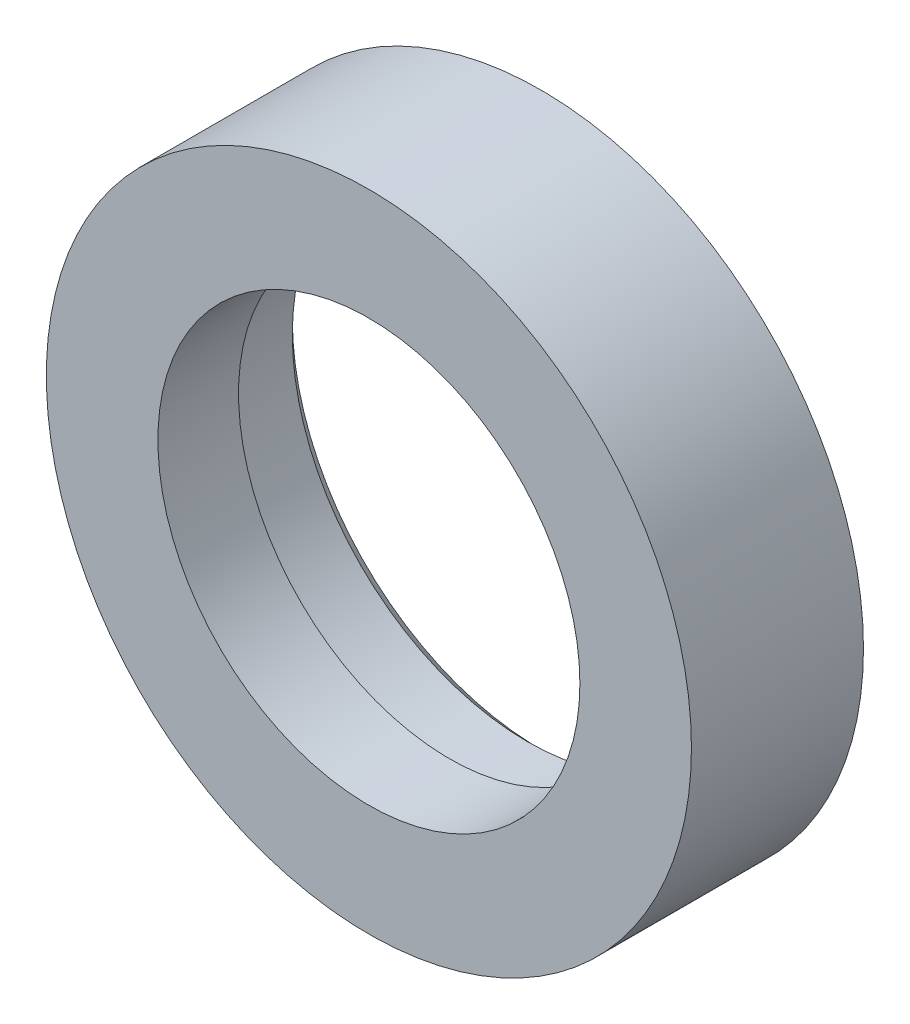
ISO-10303-21;
HEADER;
FILE_DESCRIPTION(('STEP AP214'),'2;1');
FILE_NAME('part.step','',(''),(''),'','','');
FILE_SCHEMA(('AUTOMOTIVE_DESIGN { 1 0 10303 214 1 1 1 1 }'));
ENDSEC;
DATA;
#1=APPLICATION_CONTEXT('core data for automotive mechanical design processes');
#2=APPLICATION_PROTOCOL_DEFINITION('international standard','automotive_design',2000,#1);
#3=PRODUCT_CONTEXT('',#1,'mechanical');
#4=PRODUCT('Part','Part','',(#3));
#5=PRODUCT_RELATED_PRODUCT_CATEGORY('part','',(#4));
#6=PRODUCT_DEFINITION_FORMATION('','',#4);
#7=PRODUCT_DEFINITION_CONTEXT('part definition',#1,'design');
#8=PRODUCT_DEFINITION('design','',#6,#7);
#9=PRODUCT_DEFINITION_SHAPE('','',#8);
#10=(LENGTH_UNIT() NAMED_UNIT(*) SI_UNIT(.MILLI.,.METRE.));
#11=(NAMED_UNIT(*) PLANE_ANGLE_UNIT() SI_UNIT($,.RADIAN.));
#12=(NAMED_UNIT(*) SI_UNIT($,.STERADIAN.) SOLID_ANGLE_UNIT());
#13=UNCERTAINTY_MEASURE_WITH_UNIT(LENGTH_MEASURE(1.E-05),#10,'distance_accuracy_value','');
#14=(GEOMETRIC_REPRESENTATION_CONTEXT(3) GLOBAL_UNCERTAINTY_ASSIGNED_CONTEXT((#13)) GLOBAL_UNIT_ASSIGNED_CONTEXT((#10,
#11,#12)) REPRESENTATION_CONTEXT('',''));
#15=CARTESIAN_POINT('',(0.,0.,0.));
#16=DIRECTION('',(0.,0.,1.));
#17=DIRECTION('',(1.,0.,0.));
#18=AXIS2_PLACEMENT_3D('',#15,#16,#17);
#19=CARTESIAN_POINT('',(15.7,0.,-5.66513157894738));
#20=DIRECTION('',(0.,0.,1.));
#21=DIRECTION('',(1.,0.,0.));
#22=AXIS2_PLACEMENT_3D('',#19,#20,#21);
#23=PLANE('',#22);
#24=CARTESIAN_POINT('',(0.,0.,-5.66513157894738));
#25=DIRECTION('',(0.,0.,1.));
#26=DIRECTION('',(1.,0.,0.));
#27=AXIS2_PLACEMENT_3D('',#24,#25,#26);
#28=CIRCLE('',#27,24.);
#29=CARTESIAN_POINT('',(24.,0.,-5.66513157894738));
#30=VERTEX_POINT('',#29);
#31=EDGE_CURVE('E41',#30,#30,#28,.T.);
#32=ORIENTED_EDGE('',*,*,#31,.T.);
#33=EDGE_LOOP('',(#32));
#34=FACE_BOUND('',#33,.T.);
#35=CARTESIAN_POINT('',(0.,0.,-5.66513157894738));
#36=DIRECTION('',(0.,0.,1.));
#37=DIRECTION('',(1.,0.,0.));
#38=AXIS2_PLACEMENT_3D('',#35,#36,#37);
#39=CIRCLE('',#38,15.7);
#40=CARTESIAN_POINT('',(15.7,0.,-5.66513157894738));
#41=VERTEX_POINT('',#40);
#42=EDGE_CURVE('E56',#41,#41,#39,.T.);
#43=ORIENTED_EDGE('',*,*,#42,.F.);
#44=EDGE_LOOP('',(#43));
#45=FACE_BOUND('',#44,.T.);
#46=ADVANCED_FACE('F30',(#34,#45),#23,.T.);
#47=CARTESIAN_POINT('',(0.,0.,0.));
#48=DIRECTION('',(0.,0.,1.));
#49=DIRECTION('',(1.,0.,0.));
#50=AXIS2_PLACEMENT_3D('',#47,#48,#49);
#51=CYLINDRICAL_SURFACE('',#50,24.);
#52=CARTESIAN_POINT('',(0.,0.,-18.4651315789474));
#53=DIRECTION('',(0.,0.,1.));
#54=DIRECTION('',(1.,0.,0.));
#55=AXIS2_PLACEMENT_3D('',#52,#53,#54);
#56=CIRCLE('',#55,24.);
#57=CARTESIAN_POINT('',(24.,0.,-18.4651315789474));
#58=VERTEX_POINT('',#57);
#59=EDGE_CURVE('E45',#58,#58,#56,.T.);
#60=ORIENTED_EDGE('',*,*,#59,.T.);
#61=EDGE_LOOP('',(#60));
#62=FACE_BOUND('',#61,.T.);
#63=ORIENTED_EDGE('',*,*,#31,.F.);
#64=EDGE_LOOP('',(#63));
#65=FACE_BOUND('',#64,.T.);
#66=ADVANCED_FACE('F64',(#62,#65),#51,.T.);
#67=CARTESIAN_POINT('',(24.,0.,-18.4651315789474));
#68=DIRECTION('',(0.,0.,-1.));
#69=DIRECTION('',(-1.,0.,0.));
#70=AXIS2_PLACEMENT_3D('',#67,#68,#69);
#71=PLANE('',#70);
#72=CARTESIAN_POINT('',(0.,0.,-18.4651315789474));
#73=DIRECTION('',(0.,0.,-1.));
#74=DIRECTION('',(-1.,0.,0.));
#75=AXIS2_PLACEMENT_3D('',#72,#73,#74);
#76=CIRCLE('',#75,18.5);
#77=CARTESIAN_POINT('',(-18.5,0.,-18.4651315789474));
#78=VERTEX_POINT('',#77);
#79=EDGE_CURVE('E37',#78,#78,#76,.F.);
#80=ORIENTED_EDGE('',*,*,#79,.T.);
#81=EDGE_LOOP('',(#80));
#82=FACE_BOUND('',#81,.T.);
#83=ORIENTED_EDGE('',*,*,#59,.F.);
#84=EDGE_LOOP('',(#83));
#85=FACE_BOUND('',#84,.T.);
#86=ADVANCED_FACE('F69',(#82,#85),#71,.T.);
#87=CARTESIAN_POINT('',(0.,0.,0.));
#88=DIRECTION('',(0.,0.,1.));
#89=DIRECTION('',(1.,0.,0.));
#90=AXIS2_PLACEMENT_3D('',#87,#88,#89);
#91=CYLINDRICAL_SURFACE('',#90,17.5);
#92=CARTESIAN_POINT('',(0.,0.,-17.4651315789474));
#93=DIRECTION('',(0.,0.,-1.));
#94=DIRECTION('',(-1.,0.,0.));
#95=AXIS2_PLACEMENT_3D('',#92,#93,#94);
#96=CIRCLE('',#95,17.5);
#97=CARTESIAN_POINT('',(-17.5,0.,-17.4651315789474));
#98=VERTEX_POINT('',#97);
#99=EDGE_CURVE('E10',#98,#98,#96,.T.);
#100=ORIENTED_EDGE('',*,*,#99,.T.);
#101=EDGE_LOOP('',(#100));
#102=FACE_BOUND('',#101,.T.);
#103=CARTESIAN_POINT('',(0.,0.,-11.6651315789474));
#104=DIRECTION('',(0.,0.,1.));
#105=DIRECTION('',(1.,0.,0.));
#106=AXIS2_PLACEMENT_3D('',#103,#104,#105);
#107=CIRCLE('',#106,17.5);
#108=CARTESIAN_POINT('',(17.5,0.,-11.6651315789474));
#109=VERTEX_POINT('',#108);
#110=EDGE_CURVE('E50',#109,#109,#107,.T.);
#111=ORIENTED_EDGE('',*,*,#110,.T.);
#112=EDGE_LOOP('',(#111));
#113=FACE_BOUND('',#112,.T.);
#114=ADVANCED_FACE('F75',(#102,#113),#91,.F.);
#115=CARTESIAN_POINT('',(17.5,0.,-11.6651315789474));
#116=DIRECTION('',(0.,0.,-1.));
#117=DIRECTION('',(-1.,0.,0.));
#118=AXIS2_PLACEMENT_3D('',#115,#116,#117);
#119=PLANE('',#118);
#120=CARTESIAN_POINT('',(0.,0.,-11.6651315789474));
#121=DIRECTION('',(0.,0.,1.));
#122=DIRECTION('',(1.,0.,0.));
#123=AXIS2_PLACEMENT_3D('',#120,#121,#122);
#124=CIRCLE('',#123,15.7);
#125=CARTESIAN_POINT('',(15.7,0.,-11.6651315789474));
#126=VERTEX_POINT('',#125);
#127=EDGE_CURVE('E53',#126,#126,#124,.T.);
#128=ORIENTED_EDGE('',*,*,#127,.T.);
#129=EDGE_LOOP('',(#128));
#130=FACE_BOUND('',#129,.T.);
#131=ORIENTED_EDGE('',*,*,#110,.F.);
#132=EDGE_LOOP('',(#131));
#133=FACE_BOUND('',#132,.T.);
#134=ADVANCED_FACE('F78',(#130,#133),#119,.T.);
#135=CARTESIAN_POINT('',(0.,0.,0.));
#136=DIRECTION('',(0.,0.,1.));
#137=DIRECTION('',(1.,0.,0.));
#138=AXIS2_PLACEMENT_3D('',#135,#136,#137);
#139=CYLINDRICAL_SURFACE('',#138,15.7);
#140=ORIENTED_EDGE('',*,*,#42,.T.);
#141=EDGE_LOOP('',(#140));
#142=FACE_BOUND('',#141,.T.);
#143=ORIENTED_EDGE('',*,*,#127,.F.);
#144=EDGE_LOOP('',(#143));
#145=FACE_BOUND('',#144,.T.);
#146=ADVANCED_FACE('F60',(#142,#145),#139,.F.);
#147=CARTESIAN_POINT('',(0.,0.,-18.4651315789474));
#148=DIRECTION('',(0.,0.,-1.));
#149=DIRECTION('',(-1.,0.,0.));
#150=AXIS2_PLACEMENT_3D('',#147,#148,#149);
#151=CONICAL_SURFACE('',#150,18.5,0.785398163397447);
#152=ORIENTED_EDGE('',*,*,#99,.F.);
#153=EDGE_LOOP('',(#152));
#154=FACE_BOUND('',#153,.T.);
#155=ORIENTED_EDGE('',*,*,#79,.F.);
#156=EDGE_LOOP('',(#155));
#157=FACE_BOUND('',#156,.T.);
#158=ADVANCED_FACE('F32',(#154,#157),#151,.F.);
#159=CLOSED_SHELL('',(#46,#66,#86,#114,#134,#146,#158));
#160=MANIFOLD_SOLID_BREP('B2',#159);
#161=ADVANCED_BREP_SHAPE_REPRESENTATION('',(#18,#160),#14);
#162=SHAPE_DEFINITION_REPRESENTATION(#9,#161);
ENDSEC;
END-ISO-10303-21;
